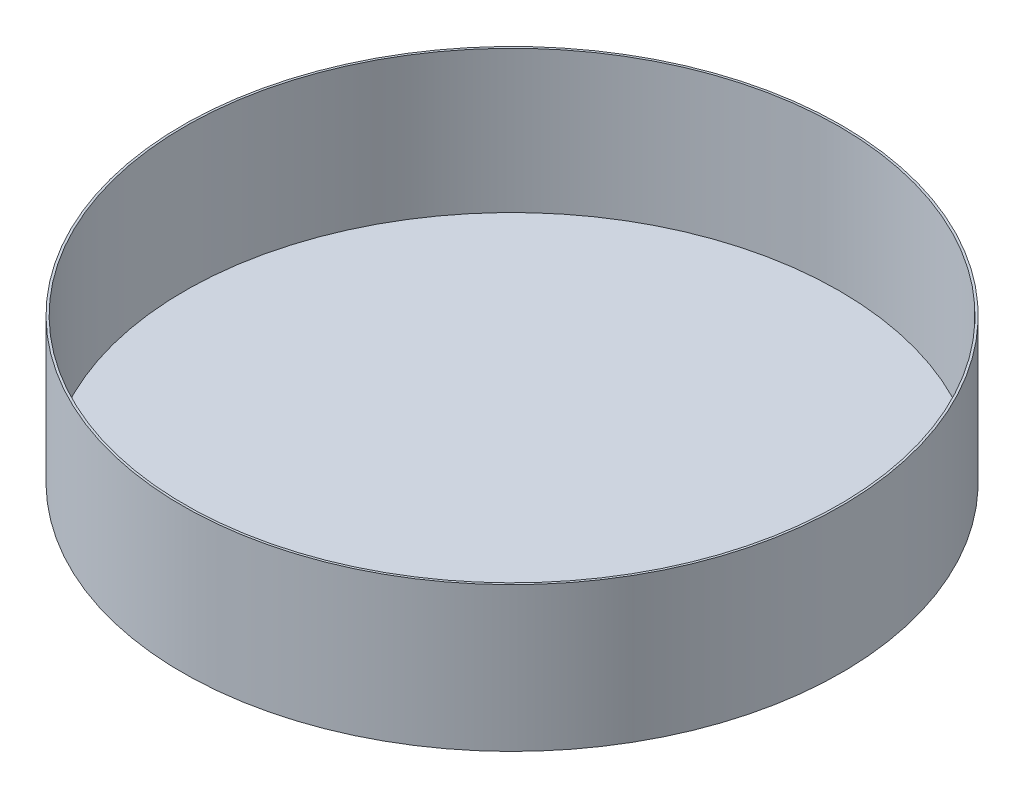
ISO-10303-21;
HEADER;
FILE_DESCRIPTION(('STEP AP214'),'2;1');
FILE_NAME('part.step','',(''),(''),'','','');
FILE_SCHEMA(('AUTOMOTIVE_DESIGN { 1 0 10303 214 1 1 1 1 }'));
ENDSEC;
DATA;
#1=APPLICATION_CONTEXT('core data for automotive mechanical design processes');
#2=APPLICATION_PROTOCOL_DEFINITION('international standard','automotive_design',2000,#1);
#3=PRODUCT_CONTEXT('',#1,'mechanical');
#4=PRODUCT('Part','Part','',(#3));
#5=PRODUCT_RELATED_PRODUCT_CATEGORY('part','',(#4));
#6=PRODUCT_DEFINITION_FORMATION('','',#4);
#7=PRODUCT_DEFINITION_CONTEXT('part definition',#1,'design');
#8=PRODUCT_DEFINITION('design','',#6,#7);
#9=PRODUCT_DEFINITION_SHAPE('','',#8);
#10=(LENGTH_UNIT() NAMED_UNIT(*) SI_UNIT(.MILLI.,.METRE.));
#11=(NAMED_UNIT(*) PLANE_ANGLE_UNIT() SI_UNIT($,.RADIAN.));
#12=(NAMED_UNIT(*) SI_UNIT($,.STERADIAN.) SOLID_ANGLE_UNIT());
#13=UNCERTAINTY_MEASURE_WITH_UNIT(LENGTH_MEASURE(1.E-05),#10,'distance_accuracy_value','');
#14=(GEOMETRIC_REPRESENTATION_CONTEXT(3) GLOBAL_UNCERTAINTY_ASSIGNED_CONTEXT((#13)) GLOBAL_UNIT_ASSIGNED_CONTEXT((#10,
#11,#12)) REPRESENTATION_CONTEXT('',''));
#15=CARTESIAN_POINT('',(0.,0.,0.));
#16=DIRECTION('',(0.,0.,1.));
#17=DIRECTION('',(1.,0.,0.));
#18=AXIS2_PLACEMENT_3D('',#15,#16,#17);
#19=CARTESIAN_POINT('',(1505.54,650.000000000002,0.));
#20=DIRECTION('',(0.,1.,0.));
#21=DIRECTION('',(0.,0.,1.));
#22=AXIS2_PLACEMENT_3D('',#19,#20,#21);
#23=PLANE('',#22);
#24=CARTESIAN_POINT('',(0.,650.000000000003,0.));
#25=DIRECTION('',(0.,-1.,0.));
#26=DIRECTION('',(0.,0.,-1.));
#27=AXIS2_PLACEMENT_3D('',#24,#25,#26);
#28=CIRCLE('',#27,1495.54000000001);
#29=CARTESIAN_POINT('',(0.,650.000000000003,-1495.54000000001));
#30=VERTEX_POINT('',#29);
#31=EDGE_CURVE('E48',#30,#30,#28,.T.);
#32=ORIENTED_EDGE('',*,*,#31,.T.);
#33=EDGE_LOOP('',(#32));
#34=FACE_BOUND('',#33,.T.);
#35=CARTESIAN_POINT('',(0.,650.,0.));
#36=DIRECTION('',(0.,-1.,0.));
#37=DIRECTION('',(0.,0.,-1.));
#38=AXIS2_PLACEMENT_3D('',#35,#36,#37);
#39=CIRCLE('',#38,1505.54);
#40=CARTESIAN_POINT('',(0.,650.,-1505.54));
#41=VERTEX_POINT('',#40);
#42=EDGE_CURVE('E10',#41,#41,#39,.T.);
#43=ORIENTED_EDGE('',*,*,#42,.F.);
#44=EDGE_LOOP('',(#43));
#45=FACE_BOUND('',#44,.T.);
#46=ADVANCED_FACE('F34',(#34,#45),#23,.T.);
#47=CARTESIAN_POINT('',(0.,0.,0.));
#48=DIRECTION('',(0.,-1.,0.));
#49=DIRECTION('',(0.,0.,-1.));
#50=AXIS2_PLACEMENT_3D('',#47,#48,#49);
#51=CYLINDRICAL_SURFACE('',#50,1505.54);
#52=ORIENTED_EDGE('',*,*,#42,.T.);
#53=EDGE_LOOP('',(#52));
#54=FACE_BOUND('',#53,.T.);
#55=CARTESIAN_POINT('',(0.,-10.,0.));
#56=DIRECTION('',(0.,-1.,0.));
#57=DIRECTION('',(0.,0.,-1.));
#58=AXIS2_PLACEMENT_3D('',#55,#56,#57);
#59=CIRCLE('',#58,1505.54);
#60=CARTESIAN_POINT('',(0.,-10.,-1505.54));
#61=VERTEX_POINT('',#60);
#62=EDGE_CURVE('E40',#61,#61,#59,.T.);
#63=ORIENTED_EDGE('',*,*,#62,.F.);
#64=EDGE_LOOP('',(#63));
#65=FACE_BOUND('',#64,.T.);
#66=ADVANCED_FACE('F69',(#54,#65),#51,.T.);
#67=CARTESIAN_POINT('',(0.,-10.,0.));
#68=DIRECTION('',(0.,-1.,0.));
#69=DIRECTION('',(0.,0.,-1.));
#70=AXIS2_PLACEMENT_3D('',#67,#68,#69);
#71=PLANE('',#70);
#72=ORIENTED_EDGE('',*,*,#62,.T.);
#73=EDGE_LOOP('',(#72));
#74=FACE_BOUND('',#73,.T.);
#75=ADVANCED_FACE('F64',(#74),#71,.T.);
#76=CARTESIAN_POINT('',(0.,0.,0.));
#77=DIRECTION('',(0.,-1.,0.));
#78=DIRECTION('',(0.,0.,-1.));
#79=AXIS2_PLACEMENT_3D('',#76,#77,#78);
#80=PLANE('',#79);
#81=CARTESIAN_POINT('',(0.,0.,0.));
#82=DIRECTION('',(0.,-1.,0.));
#83=DIRECTION('',(0.,0.,-1.));
#84=AXIS2_PLACEMENT_3D('',#81,#82,#83);
#85=CIRCLE('',#84,1495.54);
#86=CARTESIAN_POINT('',(0.,0.,-1495.54));
#87=VERTEX_POINT('',#86);
#88=EDGE_CURVE('E44',#87,#87,#85,.T.);
#89=ORIENTED_EDGE('',*,*,#88,.F.);
#90=EDGE_LOOP('',(#89));
#91=FACE_BOUND('',#90,.T.);
#92=ADVANCED_FACE('F59',(#91),#80,.F.);
#93=CARTESIAN_POINT('',(0.,0.,0.));
#94=DIRECTION('',(0.,-1.,0.));
#95=DIRECTION('',(0.,0.,-1.));
#96=AXIS2_PLACEMENT_3D('',#93,#94,#95);
#97=CYLINDRICAL_SURFACE('',#96,1495.54);
#98=ORIENTED_EDGE('',*,*,#31,.F.);
#99=EDGE_LOOP('',(#98));
#100=FACE_BOUND('',#99,.T.);
#101=ORIENTED_EDGE('',*,*,#88,.T.);
#102=EDGE_LOOP('',(#101));
#103=FACE_BOUND('',#102,.T.);
#104=ADVANCED_FACE('F56',(#100,#103),#97,.F.);
#105=CLOSED_SHELL('',(#46,#66,#75,#92,#104));
#106=MANIFOLD_SOLID_BREP('B2',#105);
#107=ADVANCED_BREP_SHAPE_REPRESENTATION('',(#18,#106),#14);
#108=SHAPE_DEFINITION_REPRESENTATION(#9,#107);
ENDSEC;
END-ISO-10303-21;
